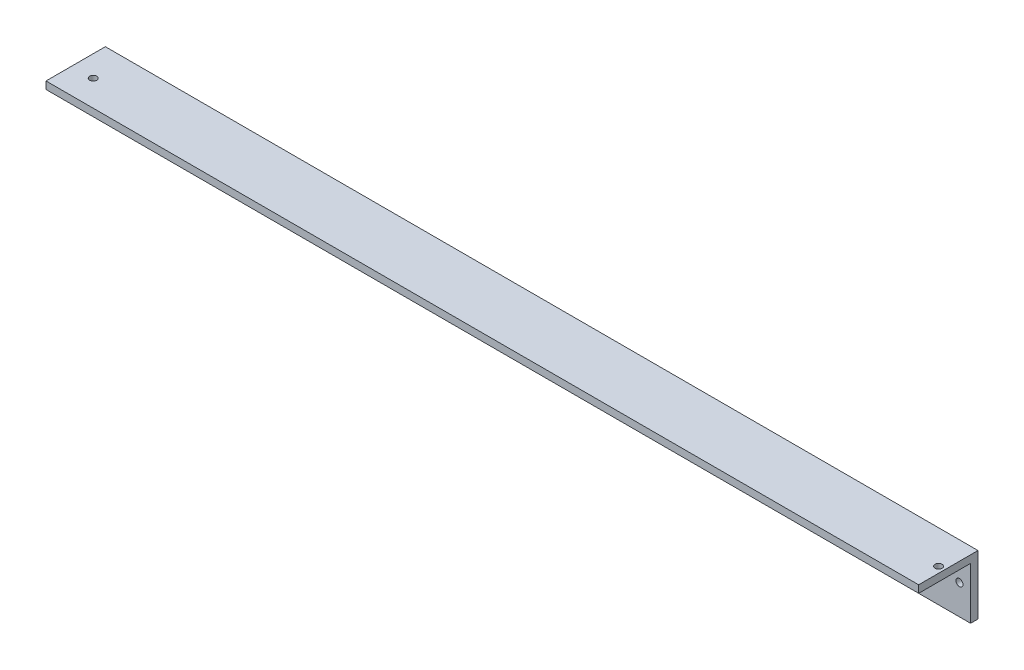
ISO-10303-21;
HEADER;
FILE_DESCRIPTION(('STEP AP214'),'2;1');
FILE_NAME('part.step','',(''),(''),'','','');
FILE_SCHEMA(('AUTOMOTIVE_DESIGN { 1 0 10303 214 1 1 1 1 }'));
ENDSEC;
DATA;
#1=APPLICATION_CONTEXT('core data for automotive mechanical design processes');
#2=APPLICATION_PROTOCOL_DEFINITION('international standard','automotive_design',2000,#1);
#3=PRODUCT_CONTEXT('',#1,'mechanical');
#4=PRODUCT('Part','Part','',(#3));
#5=PRODUCT_RELATED_PRODUCT_CATEGORY('part','',(#4));
#6=PRODUCT_DEFINITION_FORMATION('','',#4);
#7=PRODUCT_DEFINITION_CONTEXT('part definition',#1,'design');
#8=PRODUCT_DEFINITION('design','',#6,#7);
#9=PRODUCT_DEFINITION_SHAPE('','',#8);
#10=(LENGTH_UNIT() NAMED_UNIT(*) SI_UNIT(.MILLI.,.METRE.));
#11=(NAMED_UNIT(*) PLANE_ANGLE_UNIT() SI_UNIT($,.RADIAN.));
#12=(NAMED_UNIT(*) SI_UNIT($,.STERADIAN.) SOLID_ANGLE_UNIT());
#13=UNCERTAINTY_MEASURE_WITH_UNIT(LENGTH_MEASURE(1.E-05),#10,'distance_accuracy_value','');
#14=(GEOMETRIC_REPRESENTATION_CONTEXT(3) GLOBAL_UNCERTAINTY_ASSIGNED_CONTEXT((#13)) GLOBAL_UNIT_ASSIGNED_CONTEXT((#10,
#11,#12)) REPRESENTATION_CONTEXT('',''));
#15=CARTESIAN_POINT('',(0.,0.,0.));
#16=DIRECTION('',(0.,0.,1.));
#17=DIRECTION('',(1.,0.,0.));
#18=AXIS2_PLACEMENT_3D('',#15,#16,#17);
#19=CARTESIAN_POINT('',(0.,0.,10.));
#20=DIRECTION('',(0.,0.,1.));
#21=DIRECTION('',(1.,0.,0.));
#22=AXIS2_PLACEMENT_3D('',#19,#20,#21);
#23=PLANE('',#22);
#24=CARTESIAN_POINT('',(30.,40.,10.));
#25=DIRECTION('',(0.,0.,1.));
#26=DIRECTION('',(1.,0.,0.));
#27=AXIS2_PLACEMENT_3D('',#24,#25,#26);
#28=CIRCLE('',#27,4.7625);
#29=CARTESIAN_POINT('',(34.7625,40.,10.));
#30=VERTEX_POINT('',#29);
#31=EDGE_CURVE('E115',#30,#30,#28,.T.);
#32=ORIENTED_EDGE('',*,*,#31,.F.);
#33=EDGE_LOOP('',(#32));
#34=FACE_BOUND('',#33,.T.);
#35=CARTESIAN_POINT('',(1176.08,40.,10.));
#36=DIRECTION('',(0.,0.,1.));
#37=DIRECTION('',(1.,0.,0.));
#38=AXIS2_PLACEMENT_3D('',#35,#36,#37);
#39=CIRCLE('',#38,4.765);
#40=CARTESIAN_POINT('',(1180.845,40.,10.));
#41=VERTEX_POINT('',#40);
#42=EDGE_CURVE('E126',#41,#41,#39,.T.);
#43=ORIENTED_EDGE('',*,*,#42,.F.);
#44=EDGE_LOOP('',(#43));
#45=FACE_BOUND('',#44,.T.);
#46=DIRECTION('',(1.,0.,0.));
#47=VECTOR('',#46,1.);
#48=CARTESIAN_POINT('',(1206.08,70.0000000000002,10.));
#49=LINE('',#48,#47);
#50=CARTESIAN_POINT('',(15.,70.0000000000001,10.));
#51=VERTEX_POINT('',#50);
#52=CARTESIAN_POINT('',(1191.08,70.0000000000002,10.));
#53=VERTEX_POINT('',#52);
#54=EDGE_CURVE('E136',#51,#53,#49,.T.);
#55=ORIENTED_EDGE('',*,*,#54,.F.);
#56=DIRECTION('',(0.,1.,0.));
#57=VECTOR('',#56,1.);
#58=CARTESIAN_POINT('',(15.,0.,10.));
#59=LINE('',#58,#57);
#60=CARTESIAN_POINT('',(15.,0.,10.));
#61=VERTEX_POINT('',#60);
#62=EDGE_CURVE('E183',#61,#51,#59,.T.);
#63=ORIENTED_EDGE('',*,*,#62,.F.);
#64=DIRECTION('',(1.,0.,0.));
#65=VECTOR('',#64,1.);
#66=CARTESIAN_POINT('',(0.,0.,10.));
#67=LINE('',#66,#65);
#68=CARTESIAN_POINT('',(1191.08,0.,10.));
#69=VERTEX_POINT('',#68);
#70=EDGE_CURVE('E11',#61,#69,#67,.T.);
#71=ORIENTED_EDGE('',*,*,#70,.T.);
#72=DIRECTION('',(0.,-1.,0.));
#73=VECTOR('',#72,1.);
#74=CARTESIAN_POINT('',(1191.08,70.0000000000002,10.));
#75=LINE('',#74,#73);
#76=EDGE_CURVE('E175',#53,#69,#75,.T.);
#77=ORIENTED_EDGE('',*,*,#76,.F.);
#78=EDGE_LOOP('',(#55,#63,#71,#77));
#79=FACE_BOUND('',#78,.T.);
#80=ADVANCED_FACE('F38',(#34,#45,#79),#23,.T.);
#81=CARTESIAN_POINT('',(0.,0.,0.));
#82=DIRECTION('',(0.,0.,1.));
#83=DIRECTION('',(1.,0.,0.));
#84=AXIS2_PLACEMENT_3D('',#81,#82,#83);
#85=PLANE('',#84);
#86=CARTESIAN_POINT('',(30.,40.,0.));
#87=DIRECTION('',(0.,0.,1.));
#88=DIRECTION('',(1.,0.,0.));
#89=AXIS2_PLACEMENT_3D('',#86,#87,#88);
#90=CIRCLE('',#89,4.7625);
#91=CARTESIAN_POINT('',(34.7625,40.,0.));
#92=VERTEX_POINT('',#91);
#93=EDGE_CURVE('E121',#92,#92,#90,.T.);
#94=ORIENTED_EDGE('',*,*,#93,.T.);
#95=EDGE_LOOP('',(#94));
#96=FACE_BOUND('',#95,.T.);
#97=CARTESIAN_POINT('',(1176.08,40.,0.));
#98=DIRECTION('',(0.,0.,1.));
#99=DIRECTION('',(1.,0.,0.));
#100=AXIS2_PLACEMENT_3D('',#97,#98,#99);
#101=CIRCLE('',#100,4.765);
#102=CARTESIAN_POINT('',(1180.845,40.,0.));
#103=VERTEX_POINT('',#102);
#104=EDGE_CURVE('E128',#103,#103,#101,.T.);
#105=ORIENTED_EDGE('',*,*,#104,.T.);
#106=EDGE_LOOP('',(#105));
#107=FACE_BOUND('',#106,.T.);
#108=DIRECTION('',(0.,-1.,0.));
#109=VECTOR('',#108,1.);
#110=CARTESIAN_POINT('',(15.,80.,0.));
#111=LINE('',#110,#109);
#112=CARTESIAN_POINT('',(15.,80.,0.));
#113=VERTEX_POINT('',#112);
#114=CARTESIAN_POINT('',(15.,0.,0.));
#115=VERTEX_POINT('',#114);
#116=EDGE_CURVE('E94',#113,#115,#111,.T.);
#117=ORIENTED_EDGE('',*,*,#116,.F.);
#118=DIRECTION('',(-1.,0.,0.));
#119=VECTOR('',#118,1.);
#120=CARTESIAN_POINT('',(1206.08,80.0000000000002,0.));
#121=LINE('',#120,#119);
#122=CARTESIAN_POINT('',(1191.08,80.0000000000002,0.));
#123=VERTEX_POINT('',#122);
#124=EDGE_CURVE('E42',#123,#113,#121,.T.);
#125=ORIENTED_EDGE('',*,*,#124,.F.);
#126=DIRECTION('',(0.,1.,0.));
#127=VECTOR('',#126,1.);
#128=CARTESIAN_POINT('',(1191.08,0.,0.));
#129=LINE('',#128,#127);
#130=CARTESIAN_POINT('',(1191.08,0.,0.));
#131=VERTEX_POINT('',#130);
#132=EDGE_CURVE('E169',#131,#123,#129,.T.);
#133=ORIENTED_EDGE('',*,*,#132,.F.);
#134=DIRECTION('',(1.,0.,0.));
#135=VECTOR('',#134,1.);
#136=CARTESIAN_POINT('',(0.,0.,0.));
#137=LINE('',#136,#135);
#138=EDGE_CURVE('E108',#115,#131,#137,.T.);
#139=ORIENTED_EDGE('',*,*,#138,.F.);
#140=EDGE_LOOP('',(#117,#125,#133,#139));
#141=FACE_BOUND('',#140,.T.);
#142=ADVANCED_FACE('F106',(#96,#107,#141),#85,.F.);
#143=CARTESIAN_POINT('',(0.,0.,10.));
#144=DIRECTION('',(0.,1.,0.));
#145=DIRECTION('',(0.,0.,1.));
#146=AXIS2_PLACEMENT_3D('',#143,#144,#145);
#147=PLANE('',#146);
#148=DIRECTION('',(0.,0.,1.));
#149=VECTOR('',#148,1.);
#150=CARTESIAN_POINT('',(15.,0.,0.));
#151=LINE('',#150,#149);
#152=EDGE_CURVE('E110',#115,#61,#151,.T.);
#153=ORIENTED_EDGE('',*,*,#152,.F.);
#154=ORIENTED_EDGE('',*,*,#138,.T.);
#155=DIRECTION('',(0.,0.,-1.));
#156=VECTOR('',#155,1.);
#157=CARTESIAN_POINT('',(1191.08,0.,10.));
#158=LINE('',#157,#156);
#159=EDGE_CURVE('E172',#69,#131,#158,.T.);
#160=ORIENTED_EDGE('',*,*,#159,.F.);
#161=ORIENTED_EDGE('',*,*,#70,.F.);
#162=EDGE_LOOP('',(#153,#154,#160,#161));
#163=FACE_BOUND('',#162,.T.);
#164=ADVANCED_FACE('F40',(#163),#147,.F.);
#165=CARTESIAN_POINT('',(1206.08,80.0000000000002,10.));
#166=DIRECTION('',(0.,-1.,0.));
#167=DIRECTION('',(1.,0.,0.));
#168=AXIS2_PLACEMENT_3D('',#165,#166,#167);
#169=PLANE('',#168);
#170=CARTESIAN_POINT('',(1182.95683480711,80.0000000000003,45.));
#171=DIRECTION('',(0.,-1.,0.));
#172=DIRECTION('',(1.,0.,0.));
#173=AXIS2_PLACEMENT_3D('',#170,#171,#172);
#174=CIRCLE('',#173,4.765);
#175=CARTESIAN_POINT('',(1187.72183480711,80.0000000000003,45.));
#176=VERTEX_POINT('',#175);
#177=EDGE_CURVE('E140',#176,#176,#174,.T.);
#178=ORIENTED_EDGE('',*,*,#177,.T.);
#179=EDGE_LOOP('',(#178));
#180=FACE_BOUND('',#179,.T.);
#181=CARTESIAN_POINT('',(43.6611847578156,80.0000000000002,45.));
#182=DIRECTION('',(0.,-1.,0.));
#183=DIRECTION('',(1.,0.,0.));
#184=AXIS2_PLACEMENT_3D('',#181,#182,#183);
#185=CIRCLE('',#184,4.765);
#186=CARTESIAN_POINT('',(48.4261847578155,80.0000000000002,45.));
#187=VERTEX_POINT('',#186);
#188=EDGE_CURVE('E149',#187,#187,#185,.T.);
#189=ORIENTED_EDGE('',*,*,#188,.T.);
#190=EDGE_LOOP('',(#189));
#191=FACE_BOUND('',#190,.T.);
#192=DIRECTION('',(0.,0.,-1.));
#193=VECTOR('',#192,1.);
#194=CARTESIAN_POINT('',(15.,80.,80.));
#195=LINE('',#194,#193);
#196=CARTESIAN_POINT('',(15.,80.,80.));
#197=VERTEX_POINT('',#196);
#198=EDGE_CURVE('E91',#197,#113,#195,.T.);
#199=ORIENTED_EDGE('',*,*,#198,.F.);
#200=DIRECTION('',(-1.,0.,0.));
#201=VECTOR('',#200,1.);
#202=CARTESIAN_POINT('',(0.,80.,80.));
#203=LINE('',#202,#201);
#204=CARTESIAN_POINT('',(1191.08,80.0000000000002,80.));
#205=VERTEX_POINT('',#204);
#206=EDGE_CURVE('E132',#205,#197,#203,.T.);
#207=ORIENTED_EDGE('',*,*,#206,.F.);
#208=DIRECTION('',(0.,0.,1.));
#209=VECTOR('',#208,1.);
#210=CARTESIAN_POINT('',(1191.08,80.0000000000002,0.));
#211=LINE('',#210,#209);
#212=EDGE_CURVE('E63',#123,#205,#211,.T.);
#213=ORIENTED_EDGE('',*,*,#212,.F.);
#214=ORIENTED_EDGE('',*,*,#124,.T.);
#215=EDGE_LOOP('',(#199,#207,#213,#214));
#216=FACE_BOUND('',#215,.T.);
#217=ADVANCED_FACE('F112',(#180,#191,#216),#169,.F.);
#218=CARTESIAN_POINT('',(1206.08,70.0000000000002,80.));
#219=DIRECTION('',(0.,1.,0.));
#220=DIRECTION('',(-1.,0.,0.));
#221=AXIS2_PLACEMENT_3D('',#218,#219,#220);
#222=PLANE('',#221);
#223=CARTESIAN_POINT('',(1182.95683480711,70.0000000000002,45.));
#224=DIRECTION('',(0.,-1.,0.));
#225=DIRECTION('',(1.,0.,0.));
#226=AXIS2_PLACEMENT_3D('',#223,#224,#225);
#227=CIRCLE('',#226,4.765);
#228=CARTESIAN_POINT('',(1187.72183480711,70.0000000000002,45.));
#229=VERTEX_POINT('',#228);
#230=EDGE_CURVE('E154',#229,#229,#227,.T.);
#231=ORIENTED_EDGE('',*,*,#230,.F.);
#232=EDGE_LOOP('',(#231));
#233=FACE_BOUND('',#232,.T.);
#234=CARTESIAN_POINT('',(43.6611847578156,70.,45.));
#235=DIRECTION('',(0.,-1.,0.));
#236=DIRECTION('',(1.,0.,0.));
#237=AXIS2_PLACEMENT_3D('',#234,#235,#236);
#238=CIRCLE('',#237,4.765);
#239=CARTESIAN_POINT('',(48.4261847578155,70.,45.));
#240=VERTEX_POINT('',#239);
#241=EDGE_CURVE('E145',#240,#240,#238,.T.);
#242=ORIENTED_EDGE('',*,*,#241,.F.);
#243=EDGE_LOOP('',(#242));
#244=FACE_BOUND('',#243,.T.);
#245=DIRECTION('',(0.,0.,1.));
#246=VECTOR('',#245,1.);
#247=CARTESIAN_POINT('',(15.,70.0000000000001,10.));
#248=LINE('',#247,#246);
#249=CARTESIAN_POINT('',(14.9999999999999,70.,80.));
#250=VERTEX_POINT('',#249);
#251=EDGE_CURVE('E55',#51,#250,#248,.T.);
#252=ORIENTED_EDGE('',*,*,#251,.F.);
#253=ORIENTED_EDGE('',*,*,#54,.T.);
#254=DIRECTION('',(0.,0.,-1.));
#255=VECTOR('',#254,1.);
#256=CARTESIAN_POINT('',(1191.08,70.0000000000002,80.));
#257=LINE('',#256,#255);
#258=CARTESIAN_POINT('',(1191.08,70.0000000000002,80.));
#259=VERTEX_POINT('',#258);
#260=EDGE_CURVE('E150',#259,#53,#257,.T.);
#261=ORIENTED_EDGE('',*,*,#260,.F.);
#262=DIRECTION('',(1.,0.,0.));
#263=VECTOR('',#262,1.);
#264=CARTESIAN_POINT('',(1206.08,70.0000000000002,80.));
#265=LINE('',#264,#263);
#266=EDGE_CURVE('E139',#250,#259,#265,.T.);
#267=ORIENTED_EDGE('',*,*,#266,.F.);
#268=EDGE_LOOP('',(#252,#253,#261,#267));
#269=FACE_BOUND('',#268,.T.);
#270=ADVANCED_FACE('F196',(#233,#244,#269),#222,.F.);
#271=CARTESIAN_POINT('',(0.,0.,80.));
#272=DIRECTION('',(0.,0.,-1.));
#273=DIRECTION('',(-1.,0.,0.));
#274=AXIS2_PLACEMENT_3D('',#271,#272,#273);
#275=PLANE('',#274);
#276=DIRECTION('',(0.,1.,0.));
#277=VECTOR('',#276,1.);
#278=CARTESIAN_POINT('',(15.,70.,80.));
#279=LINE('',#278,#277);
#280=EDGE_CURVE('E96',#250,#197,#279,.T.);
#281=ORIENTED_EDGE('',*,*,#280,.F.);
#282=ORIENTED_EDGE('',*,*,#266,.T.);
#283=DIRECTION('',(0.,-1.,0.));
#284=VECTOR('',#283,1.);
#285=CARTESIAN_POINT('',(1191.08,80.0000000000002,80.));
#286=LINE('',#285,#284);
#287=EDGE_CURVE('E164',#205,#259,#286,.T.);
#288=ORIENTED_EDGE('',*,*,#287,.F.);
#289=ORIENTED_EDGE('',*,*,#206,.T.);
#290=EDGE_LOOP('',(#281,#282,#288,#289));
#291=FACE_BOUND('',#290,.T.);
#292=ADVANCED_FACE('F198',(#291),#275,.F.);
#293=CARTESIAN_POINT('',(30.,40.,10.));
#294=DIRECTION('',(0.,0.,-1.));
#295=DIRECTION('',(-1.,0.,0.));
#296=AXIS2_PLACEMENT_3D('',#293,#294,#295);
#297=CYLINDRICAL_SURFACE('',#296,4.7625);
#298=ORIENTED_EDGE('',*,*,#31,.T.);
#299=EDGE_LOOP('',(#298));
#300=FACE_BOUND('',#299,.T.);
#301=ORIENTED_EDGE('',*,*,#93,.F.);
#302=EDGE_LOOP('',(#301));
#303=FACE_BOUND('',#302,.T.);
#304=ADVANCED_FACE('F200',(#300,#303),#297,.F.);
#305=CARTESIAN_POINT('',(1176.08,40.,10.));
#306=DIRECTION('',(0.,0.,-1.));
#307=DIRECTION('',(-1.,0.,0.));
#308=AXIS2_PLACEMENT_3D('',#305,#306,#307);
#309=CYLINDRICAL_SURFACE('',#308,4.765);
#310=ORIENTED_EDGE('',*,*,#42,.T.);
#311=EDGE_LOOP('',(#310));
#312=FACE_BOUND('',#311,.T.);
#313=ORIENTED_EDGE('',*,*,#104,.F.);
#314=EDGE_LOOP('',(#313));
#315=FACE_BOUND('',#314,.T.);
#316=ADVANCED_FACE('F207',(#312,#315),#309,.F.);
#317=CARTESIAN_POINT('',(43.6611847578156,80.0000000000002,45.));
#318=DIRECTION('',(0.,-1.,0.));
#319=DIRECTION('',(1.,0.,0.));
#320=AXIS2_PLACEMENT_3D('',#317,#318,#319);
#321=CYLINDRICAL_SURFACE('',#320,4.765);
#322=ORIENTED_EDGE('',*,*,#188,.F.);
#323=EDGE_LOOP('',(#322));
#324=FACE_BOUND('',#323,.T.);
#325=ORIENTED_EDGE('',*,*,#241,.T.);
#326=EDGE_LOOP('',(#325));
#327=FACE_BOUND('',#326,.T.);
#328=ADVANCED_FACE('F234',(#324,#327),#321,.F.);
#329=CARTESIAN_POINT('',(1182.95683480711,80.0000000000003,45.));
#330=DIRECTION('',(0.,-1.,0.));
#331=DIRECTION('',(1.,0.,0.));
#332=AXIS2_PLACEMENT_3D('',#329,#330,#331);
#333=CYLINDRICAL_SURFACE('',#332,4.765);
#334=ORIENTED_EDGE('',*,*,#177,.F.);
#335=EDGE_LOOP('',(#334));
#336=FACE_BOUND('',#335,.T.);
#337=ORIENTED_EDGE('',*,*,#230,.T.);
#338=EDGE_LOOP('',(#337));
#339=FACE_BOUND('',#338,.T.);
#340=ADVANCED_FACE('F237',(#336,#339),#333,.F.);
#341=CARTESIAN_POINT('',(1191.08,0.,0.));
#342=DIRECTION('',(1.,0.,0.));
#343=DIRECTION('',(0.,0.,-1.));
#344=AXIS2_PLACEMENT_3D('',#341,#342,#343);
#345=PLANE('',#344);
#346=ORIENTED_EDGE('',*,*,#76,.T.);
#347=ORIENTED_EDGE('',*,*,#159,.T.);
#348=ORIENTED_EDGE('',*,*,#132,.T.);
#349=ORIENTED_EDGE('',*,*,#212,.T.);
#350=ORIENTED_EDGE('',*,*,#287,.T.);
#351=ORIENTED_EDGE('',*,*,#260,.T.);
#352=EDGE_LOOP('',(#346,#347,#348,#349,#350,#351));
#353=FACE_BOUND('',#352,.T.);
#354=ADVANCED_FACE('F192',(#353),#345,.T.);
#355=CARTESIAN_POINT('',(15.,0.,0.));
#356=DIRECTION('',(-1.,0.,0.));
#357=DIRECTION('',(0.,-1.,0.));
#358=AXIS2_PLACEMENT_3D('',#355,#356,#357);
#359=PLANE('',#358);
#360=ORIENTED_EDGE('',*,*,#198,.T.);
#361=ORIENTED_EDGE('',*,*,#116,.T.);
#362=ORIENTED_EDGE('',*,*,#152,.T.);
#363=ORIENTED_EDGE('',*,*,#62,.T.);
#364=ORIENTED_EDGE('',*,*,#251,.T.);
#365=ORIENTED_EDGE('',*,*,#280,.T.);
#366=EDGE_LOOP('',(#360,#361,#362,#363,#364,#365));
#367=FACE_BOUND('',#366,.T.);
#368=ADVANCED_FACE('F93',(#367),#359,.T.);
#369=CLOSED_SHELL('',(#80,#142,#164,#217,#270,#292,#304,#316,#328,#340,#354,#368));
#370=MANIFOLD_SOLID_BREP('B2',#369);
#371=ADVANCED_BREP_SHAPE_REPRESENTATION('',(#18,#370),#14);
#372=SHAPE_DEFINITION_REPRESENTATION(#9,#371);
ENDSEC;
END-ISO-10303-21;
